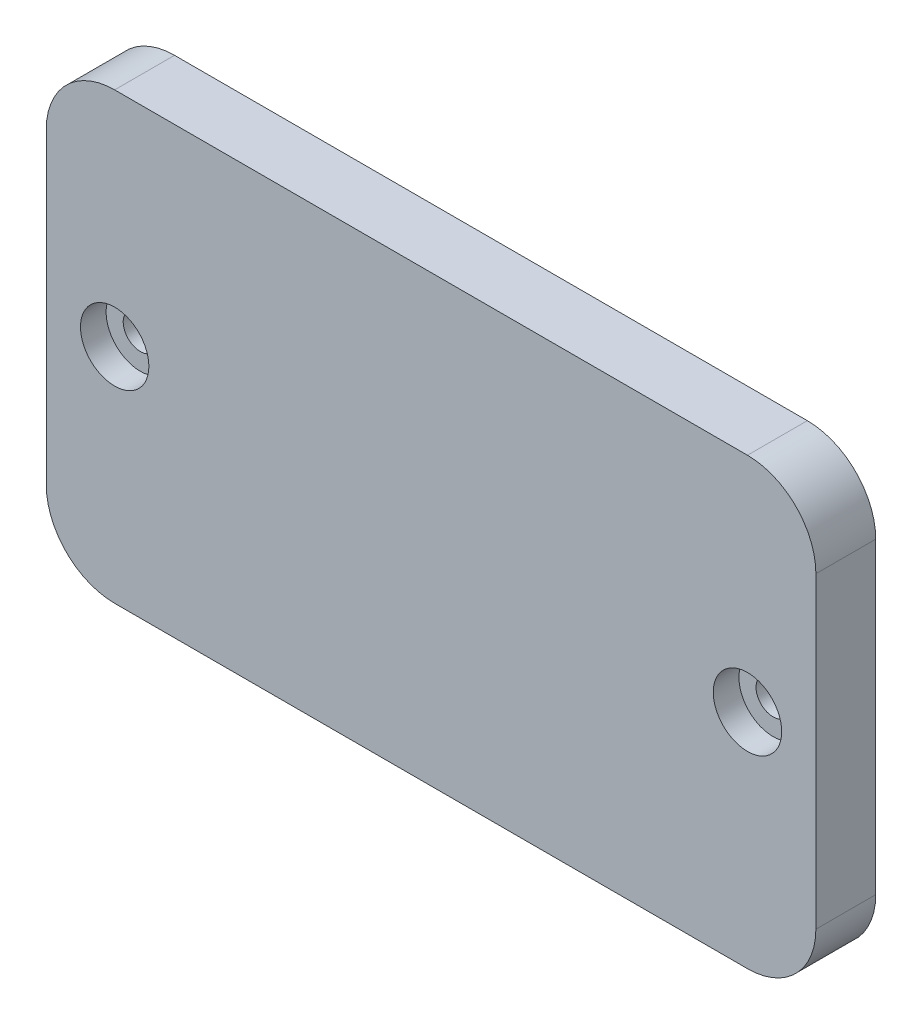
ISO-10303-21;
HEADER;
FILE_DESCRIPTION(('STEP AP214'),'2;1');
FILE_NAME('part.step','',(''),(''),'','','');
FILE_SCHEMA(('AUTOMOTIVE_DESIGN { 1 0 10303 214 1 1 1 1 }'));
ENDSEC;
DATA;
#1=APPLICATION_CONTEXT('core data for automotive mechanical design processes');
#2=APPLICATION_PROTOCOL_DEFINITION('international standard','automotive_design',2000,#1);
#3=PRODUCT_CONTEXT('',#1,'mechanical');
#4=PRODUCT('Part','Part','',(#3));
#5=PRODUCT_RELATED_PRODUCT_CATEGORY('part','',(#4));
#6=PRODUCT_DEFINITION_FORMATION('','',#4);
#7=PRODUCT_DEFINITION_CONTEXT('part definition',#1,'design');
#8=PRODUCT_DEFINITION('design','',#6,#7);
#9=PRODUCT_DEFINITION_SHAPE('','',#8);
#10=(LENGTH_UNIT() NAMED_UNIT(*) SI_UNIT(.MILLI.,.METRE.));
#11=(NAMED_UNIT(*) PLANE_ANGLE_UNIT() SI_UNIT($,.RADIAN.));
#12=(NAMED_UNIT(*) SI_UNIT($,.STERADIAN.) SOLID_ANGLE_UNIT());
#13=UNCERTAINTY_MEASURE_WITH_UNIT(LENGTH_MEASURE(1.E-05),#10,'distance_accuracy_value','');
#14=(GEOMETRIC_REPRESENTATION_CONTEXT(3) GLOBAL_UNCERTAINTY_ASSIGNED_CONTEXT((#13)) GLOBAL_UNIT_ASSIGNED_CONTEXT((#10,
#11,#12)) REPRESENTATION_CONTEXT('',''));
#15=CARTESIAN_POINT('',(0.,0.,0.));
#16=DIRECTION('',(0.,0.,1.));
#17=DIRECTION('',(1.,0.,0.));
#18=AXIS2_PLACEMENT_3D('',#15,#16,#17);
#19=CARTESIAN_POINT('',(0.,0.,3.5));
#20=DIRECTION('',(0.,0.,-1.));
#21=DIRECTION('',(-1.,0.,0.));
#22=AXIS2_PLACEMENT_3D('',#19,#20,#21);
#23=CYLINDRICAL_SURFACE('',#22,1.);
#24=CARTESIAN_POINT('',(0.,0.,0.));
#25=DIRECTION('',(0.,0.,1.));
#26=DIRECTION('',(1.,0.,0.));
#27=AXIS2_PLACEMENT_3D('',#24,#25,#26);
#28=CIRCLE('',#27,1.);
#29=CARTESIAN_POINT('',(1.,0.,0.));
#30=VERTEX_POINT('',#29);
#31=EDGE_CURVE('E180',#30,#30,#28,.T.);
#32=ORIENTED_EDGE('',*,*,#31,.F.);
#33=EDGE_LOOP('',(#32));
#34=FACE_BOUND('',#33,.T.);
#35=CARTESIAN_POINT('',(0.,0.,2.));
#36=DIRECTION('',(0.,0.,1.));
#37=DIRECTION('',(1.,0.,0.));
#38=AXIS2_PLACEMENT_3D('',#35,#36,#37);
#39=CIRCLE('',#38,1.);
#40=CARTESIAN_POINT('',(1.,0.,2.));
#41=VERTEX_POINT('',#40);
#42=EDGE_CURVE('E37',#41,#41,#39,.T.);
#43=ORIENTED_EDGE('',*,*,#42,.T.);
#44=EDGE_LOOP('',(#43));
#45=FACE_BOUND('',#44,.T.);
#46=ADVANCED_FACE('F33',(#34,#45),#23,.F.);
#47=CARTESIAN_POINT('',(37.,0.,3.5));
#48=DIRECTION('',(0.,0.,-1.));
#49=DIRECTION('',(-1.,0.,0.));
#50=AXIS2_PLACEMENT_3D('',#47,#48,#49);
#51=CYLINDRICAL_SURFACE('',#50,0.999999999999998);
#52=CARTESIAN_POINT('',(37.,0.,0.));
#53=DIRECTION('',(0.,0.,1.));
#54=DIRECTION('',(1.,0.,0.));
#55=AXIS2_PLACEMENT_3D('',#52,#53,#54);
#56=CIRCLE('',#55,0.999999999999998);
#57=CARTESIAN_POINT('',(38.,0.,0.));
#58=VERTEX_POINT('',#57);
#59=EDGE_CURVE('E163',#58,#58,#56,.T.);
#60=ORIENTED_EDGE('',*,*,#59,.F.);
#61=EDGE_LOOP('',(#60));
#62=FACE_BOUND('',#61,.T.);
#63=CARTESIAN_POINT('',(37.,0.,2.));
#64=DIRECTION('',(0.,0.,1.));
#65=DIRECTION('',(1.,0.,0.));
#66=AXIS2_PLACEMENT_3D('',#63,#64,#65);
#67=CIRCLE('',#66,0.999999999999998);
#68=CARTESIAN_POINT('',(38.,0.,2.));
#69=VERTEX_POINT('',#68);
#70=EDGE_CURVE('E157',#69,#69,#67,.T.);
#71=ORIENTED_EDGE('',*,*,#70,.T.);
#72=EDGE_LOOP('',(#71));
#73=FACE_BOUND('',#72,.T.);
#74=ADVANCED_FACE('F214',(#62,#73),#51,.F.);
#75=CARTESIAN_POINT('',(0.,0.,3.5));
#76=DIRECTION('',(0.,0.,1.));
#77=DIRECTION('',(1.,0.,0.));
#78=AXIS2_PLACEMENT_3D('',#75,#76,#77);
#79=PLANE('',#78);
#80=CARTESIAN_POINT('',(0.,0.,3.5));
#81=DIRECTION('',(0.,0.,1.));
#82=DIRECTION('',(1.,0.,0.));
#83=AXIS2_PLACEMENT_3D('',#80,#81,#82);
#84=CIRCLE('',#83,2.);
#85=CARTESIAN_POINT('',(2.,0.,3.5));
#86=VERTEX_POINT('',#85);
#87=EDGE_CURVE('E165',#86,#86,#84,.T.);
#88=ORIENTED_EDGE('',*,*,#87,.F.);
#89=EDGE_LOOP('',(#88));
#90=FACE_BOUND('',#89,.T.);
#91=CARTESIAN_POINT('',(37.,0.,3.5));
#92=DIRECTION('',(0.,0.,1.));
#93=DIRECTION('',(1.,0.,0.));
#94=AXIS2_PLACEMENT_3D('',#91,#92,#93);
#95=CIRCLE('',#94,2.);
#96=CARTESIAN_POINT('',(39.,0.,3.5));
#97=VERTEX_POINT('',#96);
#98=EDGE_CURVE('E175',#97,#97,#95,.T.);
#99=ORIENTED_EDGE('',*,*,#98,.F.);
#100=EDGE_LOOP('',(#99));
#101=FACE_BOUND('',#100,.T.);
#102=DIRECTION('',(1.,0.,0.));
#103=VECTOR('',#102,1.);
#104=CARTESIAN_POINT('',(-4.,-13.,3.5));
#105=LINE('',#104,#103);
#106=CARTESIAN_POINT('',(0.,-13.,3.5));
#107=VERTEX_POINT('',#106);
#108=CARTESIAN_POINT('',(37.,-13.,3.5));
#109=VERTEX_POINT('',#108);
#110=EDGE_CURVE('E185',#107,#109,#105,.T.);
#111=ORIENTED_EDGE('',*,*,#110,.T.);
#112=CARTESIAN_POINT('',(37.,-9.,3.5));
#113=DIRECTION('',(0.,0.,1.));
#114=DIRECTION('',(1.,0.,0.));
#115=AXIS2_PLACEMENT_3D('',#112,#113,#114);
#116=CIRCLE('',#115,4.);
#117=CARTESIAN_POINT('',(41.,-8.99999999999999,3.5));
#118=VERTEX_POINT('',#117);
#119=EDGE_CURVE('E149',#109,#118,#116,.T.);
#120=ORIENTED_EDGE('',*,*,#119,.T.);
#121=DIRECTION('',(0.,1.,0.));
#122=VECTOR('',#121,1.);
#123=CARTESIAN_POINT('',(41.,13.,3.5));
#124=LINE('',#123,#122);
#125=CARTESIAN_POINT('',(41.,9.,3.5));
#126=VERTEX_POINT('',#125);
#127=EDGE_CURVE('E119',#118,#126,#124,.T.);
#128=ORIENTED_EDGE('',*,*,#127,.T.);
#129=CARTESIAN_POINT('',(37.,9.,3.5));
#130=DIRECTION('',(0.,0.,1.));
#131=DIRECTION('',(1.,0.,0.));
#132=AXIS2_PLACEMENT_3D('',#129,#130,#131);
#133=CIRCLE('',#132,4.);
#134=CARTESIAN_POINT('',(37.,13.,3.5));
#135=VERTEX_POINT('',#134);
#136=EDGE_CURVE('E55',#126,#135,#133,.T.);
#137=ORIENTED_EDGE('',*,*,#136,.T.);
#138=DIRECTION('',(-1.,0.,0.));
#139=VECTOR('',#138,1.);
#140=CARTESIAN_POINT('',(-4.,13.,3.5));
#141=LINE('',#140,#139);
#142=CARTESIAN_POINT('',(0.,13.,3.5));
#143=VERTEX_POINT('',#142);
#144=EDGE_CURVE('E135',#135,#143,#141,.T.);
#145=ORIENTED_EDGE('',*,*,#144,.T.);
#146=CARTESIAN_POINT('',(0.,9.,3.5));
#147=DIRECTION('',(0.,0.,1.));
#148=DIRECTION('',(1.,0.,0.));
#149=AXIS2_PLACEMENT_3D('',#146,#147,#148);
#150=CIRCLE('',#149,4.);
#151=CARTESIAN_POINT('',(-4.,9.,3.5));
#152=VERTEX_POINT('',#151);
#153=EDGE_CURVE('E145',#143,#152,#150,.T.);
#154=ORIENTED_EDGE('',*,*,#153,.T.);
#155=DIRECTION('',(0.,-1.,0.));
#156=VECTOR('',#155,1.);
#157=CARTESIAN_POINT('',(-4.,13.,3.5));
#158=LINE('',#157,#156);
#159=CARTESIAN_POINT('',(-4.,-8.99999999999999,3.5));
#160=VERTEX_POINT('',#159);
#161=EDGE_CURVE('E129',#152,#160,#158,.T.);
#162=ORIENTED_EDGE('',*,*,#161,.T.);
#163=CARTESIAN_POINT('',(0.,-9.,3.5));
#164=DIRECTION('',(0.,0.,1.));
#165=DIRECTION('',(1.,0.,0.));
#166=AXIS2_PLACEMENT_3D('',#163,#164,#165);
#167=CIRCLE('',#166,4.);
#168=EDGE_CURVE('E147',#160,#107,#167,.T.);
#169=ORIENTED_EDGE('',*,*,#168,.T.);
#170=EDGE_LOOP('',(#111,#120,#128,#137,#145,#154,#162,#169));
#171=FACE_BOUND('',#170,.T.);
#172=ADVANCED_FACE('F201',(#90,#101,#171),#79,.T.);
#173=CARTESIAN_POINT('',(0.,0.,0.));
#174=DIRECTION('',(0.,0.,1.));
#175=DIRECTION('',(1.,0.,0.));
#176=AXIS2_PLACEMENT_3D('',#173,#174,#175);
#177=PLANE('',#176);
#178=DIRECTION('',(0.,1.,0.));
#179=VECTOR('',#178,1.);
#180=CARTESIAN_POINT('',(41.,13.,0.));
#181=LINE('',#180,#179);
#182=CARTESIAN_POINT('',(41.,-8.99999999999999,0.));
#183=VERTEX_POINT('',#182);
#184=CARTESIAN_POINT('',(41.,9.,0.));
#185=VERTEX_POINT('',#184);
#186=EDGE_CURVE('E117',#183,#185,#181,.T.);
#187=ORIENTED_EDGE('',*,*,#186,.F.);
#188=CARTESIAN_POINT('',(37.,-9.,0.));
#189=DIRECTION('',(0.,0.,1.));
#190=DIRECTION('',(1.,0.,0.));
#191=AXIS2_PLACEMENT_3D('',#188,#189,#190);
#192=CIRCLE('',#191,4.);
#193=CARTESIAN_POINT('',(37.,-13.,0.));
#194=VERTEX_POINT('',#193);
#195=EDGE_CURVE('E100',#183,#194,#192,.F.);
#196=ORIENTED_EDGE('',*,*,#195,.T.);
#197=DIRECTION('',(1.,0.,0.));
#198=VECTOR('',#197,1.);
#199=CARTESIAN_POINT('',(-4.,-13.,0.));
#200=LINE('',#199,#198);
#201=CARTESIAN_POINT('',(0.,-13.,0.));
#202=VERTEX_POINT('',#201);
#203=EDGE_CURVE('E127',#202,#194,#200,.T.);
#204=ORIENTED_EDGE('',*,*,#203,.F.);
#205=CARTESIAN_POINT('',(0.,-9.,0.));
#206=DIRECTION('',(0.,0.,1.));
#207=DIRECTION('',(1.,0.,0.));
#208=AXIS2_PLACEMENT_3D('',#205,#206,#207);
#209=CIRCLE('',#208,4.);
#210=CARTESIAN_POINT('',(-4.,-8.99999999999999,0.));
#211=VERTEX_POINT('',#210);
#212=EDGE_CURVE('E111',#202,#211,#209,.F.);
#213=ORIENTED_EDGE('',*,*,#212,.T.);
#214=DIRECTION('',(0.,-1.,0.));
#215=VECTOR('',#214,1.);
#216=CARTESIAN_POINT('',(-4.,13.,0.));
#217=LINE('',#216,#215);
#218=CARTESIAN_POINT('',(-4.,9.,0.));
#219=VERTEX_POINT('',#218);
#220=EDGE_CURVE('E131',#219,#211,#217,.T.);
#221=ORIENTED_EDGE('',*,*,#220,.F.);
#222=CARTESIAN_POINT('',(0.,9.,0.));
#223=DIRECTION('',(0.,0.,1.));
#224=DIRECTION('',(1.,0.,0.));
#225=AXIS2_PLACEMENT_3D('',#222,#223,#224);
#226=CIRCLE('',#225,4.);
#227=CARTESIAN_POINT('',(0.,13.,0.));
#228=VERTEX_POINT('',#227);
#229=EDGE_CURVE('E138',#219,#228,#226,.F.);
#230=ORIENTED_EDGE('',*,*,#229,.T.);
#231=DIRECTION('',(-1.,0.,0.));
#232=VECTOR('',#231,1.);
#233=CARTESIAN_POINT('',(-4.,13.,0.));
#234=LINE('',#233,#232);
#235=CARTESIAN_POINT('',(37.,13.,0.));
#236=VERTEX_POINT('',#235);
#237=EDGE_CURVE('E126',#236,#228,#234,.T.);
#238=ORIENTED_EDGE('',*,*,#237,.F.);
#239=CARTESIAN_POINT('',(37.,9.,0.));
#240=DIRECTION('',(0.,0.,1.));
#241=DIRECTION('',(1.,0.,0.));
#242=AXIS2_PLACEMENT_3D('',#239,#240,#241);
#243=CIRCLE('',#242,4.);
#244=EDGE_CURVE('E120',#236,#185,#243,.F.);
#245=ORIENTED_EDGE('',*,*,#244,.T.);
#246=EDGE_LOOP('',(#187,#196,#204,#213,#221,#230,#238,#245));
#247=FACE_BOUND('',#246,.T.);
#248=ORIENTED_EDGE('',*,*,#31,.T.);
#249=EDGE_LOOP('',(#248));
#250=FACE_BOUND('',#249,.T.);
#251=ORIENTED_EDGE('',*,*,#59,.T.);
#252=EDGE_LOOP('',(#251));
#253=FACE_BOUND('',#252,.T.);
#254=ADVANCED_FACE('F123',(#247,#250,#253),#177,.F.);
#255=CARTESIAN_POINT('',(-4.,13.,3.5));
#256=DIRECTION('',(1.,0.,0.));
#257=DIRECTION('',(0.,1.,0.));
#258=AXIS2_PLACEMENT_3D('',#255,#256,#257);
#259=PLANE('',#258);
#260=ORIENTED_EDGE('',*,*,#220,.T.);
#261=DIRECTION('',(0.,0.,-1.));
#262=VECTOR('',#261,1.);
#263=CARTESIAN_POINT('',(-4.,-9.,3.5));
#264=LINE('',#263,#262);
#265=EDGE_CURVE('E154',#211,#160,#264,.F.);
#266=ORIENTED_EDGE('',*,*,#265,.T.);
#267=ORIENTED_EDGE('',*,*,#161,.F.);
#268=DIRECTION('',(0.,0.,-1.));
#269=VECTOR('',#268,1.);
#270=CARTESIAN_POINT('',(-4.,9.,3.5));
#271=LINE('',#270,#269);
#272=EDGE_CURVE('E151',#152,#219,#271,.T.);
#273=ORIENTED_EDGE('',*,*,#272,.T.);
#274=EDGE_LOOP('',(#260,#266,#267,#273));
#275=FACE_BOUND('',#274,.T.);
#276=ADVANCED_FACE('F193',(#275),#259,.F.);
#277=CARTESIAN_POINT('',(-4.,-13.,3.5));
#278=DIRECTION('',(0.,1.,0.));
#279=DIRECTION('',(0.,0.,1.));
#280=AXIS2_PLACEMENT_3D('',#277,#278,#279);
#281=PLANE('',#280);
#282=ORIENTED_EDGE('',*,*,#203,.T.);
#283=DIRECTION('',(0.,0.,-1.));
#284=VECTOR('',#283,1.);
#285=CARTESIAN_POINT('',(37.,-13.,3.5));
#286=LINE('',#285,#284);
#287=EDGE_CURVE('E105',#194,#109,#286,.F.);
#288=ORIENTED_EDGE('',*,*,#287,.T.);
#289=ORIENTED_EDGE('',*,*,#110,.F.);
#290=DIRECTION('',(0.,0.,-1.));
#291=VECTOR('',#290,1.);
#292=CARTESIAN_POINT('',(0.,-13.,3.5));
#293=LINE('',#292,#291);
#294=EDGE_CURVE('E110',#107,#202,#293,.T.);
#295=ORIENTED_EDGE('',*,*,#294,.T.);
#296=EDGE_LOOP('',(#282,#288,#289,#295));
#297=FACE_BOUND('',#296,.T.);
#298=ADVANCED_FACE('F203',(#297),#281,.F.);
#299=CARTESIAN_POINT('',(41.,13.,3.5));
#300=DIRECTION('',(-1.,0.,0.));
#301=DIRECTION('',(0.,0.,1.));
#302=AXIS2_PLACEMENT_3D('',#299,#300,#301);
#303=PLANE('',#302);
#304=ORIENTED_EDGE('',*,*,#127,.F.);
#305=DIRECTION('',(0.,0.,-1.));
#306=VECTOR('',#305,1.);
#307=CARTESIAN_POINT('',(41.,-9.,3.5));
#308=LINE('',#307,#306);
#309=EDGE_CURVE('E104',#118,#183,#308,.T.);
#310=ORIENTED_EDGE('',*,*,#309,.T.);
#311=ORIENTED_EDGE('',*,*,#186,.T.);
#312=DIRECTION('',(0.,0.,-1.));
#313=VECTOR('',#312,1.);
#314=CARTESIAN_POINT('',(41.,9.,3.5));
#315=LINE('',#314,#313);
#316=EDGE_CURVE('E121',#185,#126,#315,.F.);
#317=ORIENTED_EDGE('',*,*,#316,.T.);
#318=EDGE_LOOP('',(#304,#310,#311,#317));
#319=FACE_BOUND('',#318,.T.);
#320=ADVANCED_FACE('F116',(#319),#303,.F.);
#321=CARTESIAN_POINT('',(-4.,13.,3.5));
#322=DIRECTION('',(0.,-1.,0.));
#323=DIRECTION('',(0.,0.,-1.));
#324=AXIS2_PLACEMENT_3D('',#321,#322,#323);
#325=PLANE('',#324);
#326=ORIENTED_EDGE('',*,*,#237,.T.);
#327=DIRECTION('',(0.,0.,-1.));
#328=VECTOR('',#327,1.);
#329=CARTESIAN_POINT('',(0.,13.,3.5));
#330=LINE('',#329,#328);
#331=EDGE_CURVE('E11',#228,#143,#330,.F.);
#332=ORIENTED_EDGE('',*,*,#331,.T.);
#333=ORIENTED_EDGE('',*,*,#144,.F.);
#334=DIRECTION('',(0.,0.,-1.));
#335=VECTOR('',#334,1.);
#336=CARTESIAN_POINT('',(37.,13.,3.5));
#337=LINE('',#336,#335);
#338=EDGE_CURVE('E42',#135,#236,#337,.T.);
#339=ORIENTED_EDGE('',*,*,#338,.T.);
#340=EDGE_LOOP('',(#326,#332,#333,#339));
#341=FACE_BOUND('',#340,.T.);
#342=ADVANCED_FACE('F210',(#341),#325,.F.);
#343=CARTESIAN_POINT('',(37.,-9.,3.5));
#344=DIRECTION('',(0.,0.,-1.));
#345=DIRECTION('',(-1.,0.,0.));
#346=AXIS2_PLACEMENT_3D('',#343,#344,#345);
#347=CYLINDRICAL_SURFACE('',#346,4.);
#348=ORIENTED_EDGE('',*,*,#119,.F.);
#349=ORIENTED_EDGE('',*,*,#287,.F.);
#350=ORIENTED_EDGE('',*,*,#195,.F.);
#351=ORIENTED_EDGE('',*,*,#309,.F.);
#352=EDGE_LOOP('',(#348,#349,#350,#351));
#353=FACE_BOUND('',#352,.T.);
#354=ADVANCED_FACE('F103',(#353),#347,.T.);
#355=CARTESIAN_POINT('',(0.,-9.,3.5));
#356=DIRECTION('',(0.,0.,-1.));
#357=DIRECTION('',(-1.,0.,0.));
#358=AXIS2_PLACEMENT_3D('',#355,#356,#357);
#359=CYLINDRICAL_SURFACE('',#358,4.);
#360=ORIENTED_EDGE('',*,*,#168,.F.);
#361=ORIENTED_EDGE('',*,*,#265,.F.);
#362=ORIENTED_EDGE('',*,*,#212,.F.);
#363=ORIENTED_EDGE('',*,*,#294,.F.);
#364=EDGE_LOOP('',(#360,#361,#362,#363));
#365=FACE_BOUND('',#364,.T.);
#366=ADVANCED_FACE('F198',(#365),#359,.T.);
#367=CARTESIAN_POINT('',(0.,9.,3.5));
#368=DIRECTION('',(0.,0.,-1.));
#369=DIRECTION('',(-1.,0.,0.));
#370=AXIS2_PLACEMENT_3D('',#367,#368,#369);
#371=CYLINDRICAL_SURFACE('',#370,4.);
#372=ORIENTED_EDGE('',*,*,#153,.F.);
#373=ORIENTED_EDGE('',*,*,#331,.F.);
#374=ORIENTED_EDGE('',*,*,#229,.F.);
#375=ORIENTED_EDGE('',*,*,#272,.F.);
#376=EDGE_LOOP('',(#372,#373,#374,#375));
#377=FACE_BOUND('',#376,.T.);
#378=ADVANCED_FACE('F239',(#377),#371,.T.);
#379=CARTESIAN_POINT('',(37.,9.,3.5));
#380=DIRECTION('',(0.,0.,-1.));
#381=DIRECTION('',(-1.,0.,0.));
#382=AXIS2_PLACEMENT_3D('',#379,#380,#381);
#383=CYLINDRICAL_SURFACE('',#382,4.);
#384=ORIENTED_EDGE('',*,*,#136,.F.);
#385=ORIENTED_EDGE('',*,*,#316,.F.);
#386=ORIENTED_EDGE('',*,*,#244,.F.);
#387=ORIENTED_EDGE('',*,*,#338,.F.);
#388=EDGE_LOOP('',(#384,#385,#386,#387));
#389=FACE_BOUND('',#388,.T.);
#390=ADVANCED_FACE('F35',(#389),#383,.T.);
#391=CARTESIAN_POINT('',(37.,0.,2.));
#392=DIRECTION('',(0.,0.,1.));
#393=DIRECTION('',(1.,0.,0.));
#394=AXIS2_PLACEMENT_3D('',#391,#392,#393);
#395=CYLINDRICAL_SURFACE('',#394,2.);
#396=CARTESIAN_POINT('',(37.,0.,2.));
#397=DIRECTION('',(0.,0.,1.));
#398=DIRECTION('',(1.,0.,0.));
#399=AXIS2_PLACEMENT_3D('',#396,#397,#398);
#400=CIRCLE('',#399,2.);
#401=CARTESIAN_POINT('',(39.,0.,2.));
#402=VERTEX_POINT('',#401);
#403=EDGE_CURVE('E170',#402,#402,#400,.T.);
#404=ORIENTED_EDGE('',*,*,#403,.F.);
#405=EDGE_LOOP('',(#404));
#406=FACE_BOUND('',#405,.T.);
#407=ORIENTED_EDGE('',*,*,#98,.T.);
#408=EDGE_LOOP('',(#407));
#409=FACE_BOUND('',#408,.T.);
#410=ADVANCED_FACE('F242',(#406,#409),#395,.F.);
#411=CARTESIAN_POINT('',(37.,0.,2.));
#412=DIRECTION('',(0.,0.,1.));
#413=DIRECTION('',(1.,0.,0.));
#414=AXIS2_PLACEMENT_3D('',#411,#412,#413);
#415=PLANE('',#414);
#416=ORIENTED_EDGE('',*,*,#70,.F.);
#417=EDGE_LOOP('',(#416));
#418=FACE_BOUND('',#417,.T.);
#419=ORIENTED_EDGE('',*,*,#403,.T.);
#420=EDGE_LOOP('',(#419));
#421=FACE_BOUND('',#420,.T.);
#422=ADVANCED_FACE('F247',(#418,#421),#415,.T.);
#423=CARTESIAN_POINT('',(0.,0.,2.));
#424=DIRECTION('',(0.,0.,1.));
#425=DIRECTION('',(1.,0.,0.));
#426=AXIS2_PLACEMENT_3D('',#423,#424,#425);
#427=CYLINDRICAL_SURFACE('',#426,2.);
#428=CARTESIAN_POINT('',(0.,0.,2.));
#429=DIRECTION('',(0.,0.,1.));
#430=DIRECTION('',(1.,0.,0.));
#431=AXIS2_PLACEMENT_3D('',#428,#429,#430);
#432=CIRCLE('',#431,2.);
#433=CARTESIAN_POINT('',(2.,0.,2.));
#434=VERTEX_POINT('',#433);
#435=EDGE_CURVE('E159',#434,#434,#432,.T.);
#436=ORIENTED_EDGE('',*,*,#435,.F.);
#437=EDGE_LOOP('',(#436));
#438=FACE_BOUND('',#437,.T.);
#439=ORIENTED_EDGE('',*,*,#87,.T.);
#440=EDGE_LOOP('',(#439));
#441=FACE_BOUND('',#440,.T.);
#442=ADVANCED_FACE('F324',(#438,#441),#427,.F.);
#443=CARTESIAN_POINT('',(0.,0.,2.));
#444=DIRECTION('',(0.,0.,1.));
#445=DIRECTION('',(1.,0.,0.));
#446=AXIS2_PLACEMENT_3D('',#443,#444,#445);
#447=PLANE('',#446);
#448=ORIENTED_EDGE('',*,*,#42,.F.);
#449=EDGE_LOOP('',(#448));
#450=FACE_BOUND('',#449,.T.);
#451=ORIENTED_EDGE('',*,*,#435,.T.);
#452=EDGE_LOOP('',(#451));
#453=FACE_BOUND('',#452,.T.);
#454=ADVANCED_FACE('F333',(#450,#453),#447,.T.);
#455=CLOSED_SHELL('',(#46,#74,#172,#254,#276,#298,#320,#342,#354,#366,#378,#390,#410,#422,#442,#454));
#456=MANIFOLD_SOLID_BREP('B2',#455);
#457=ADVANCED_BREP_SHAPE_REPRESENTATION('',(#18,#456),#14);
#458=SHAPE_DEFINITION_REPRESENTATION(#9,#457);
ENDSEC;
END-ISO-10303-21;
